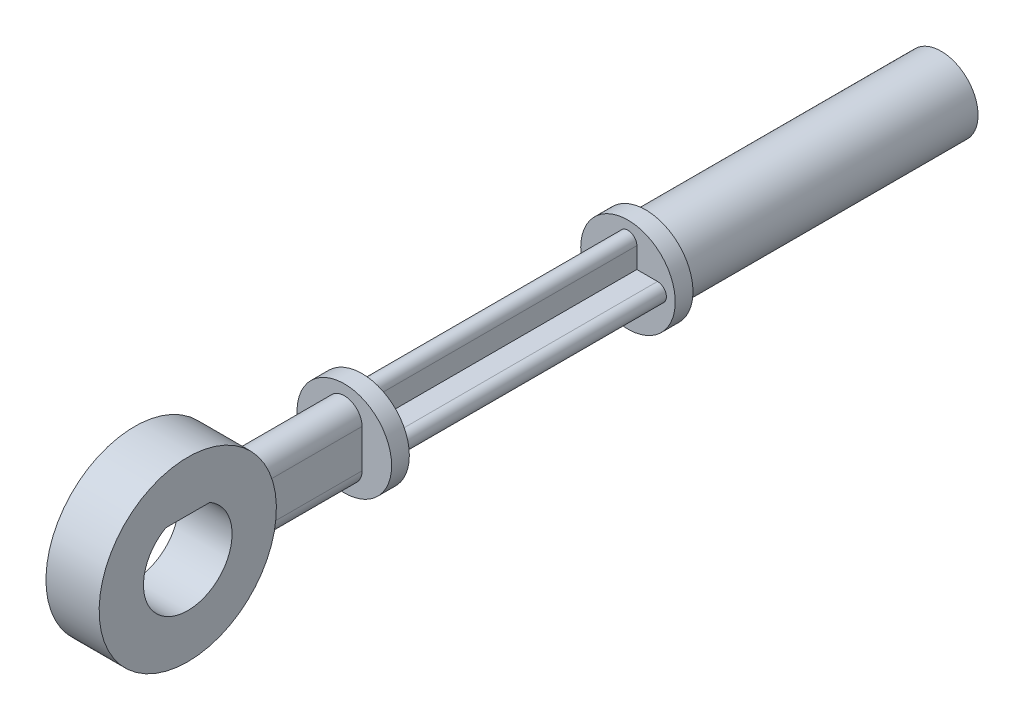
ISO-10303-21;
HEADER;
FILE_DESCRIPTION(('STEP AP214'),'2;1');
FILE_NAME('part.step','',(''),(''),'','','');
FILE_SCHEMA(('AUTOMOTIVE_DESIGN { 1 0 10303 214 1 1 1 1 }'));
ENDSEC;
DATA;
#1=APPLICATION_CONTEXT('core data for automotive mechanical design processes');
#2=APPLICATION_PROTOCOL_DEFINITION('international standard','automotive_design',2000,#1);
#3=PRODUCT_CONTEXT('',#1,'mechanical');
#4=PRODUCT('Part','Part','',(#3));
#5=PRODUCT_RELATED_PRODUCT_CATEGORY('part','',(#4));
#6=PRODUCT_DEFINITION_FORMATION('','',#4);
#7=PRODUCT_DEFINITION_CONTEXT('part definition',#1,'design');
#8=PRODUCT_DEFINITION('design','',#6,#7);
#9=PRODUCT_DEFINITION_SHAPE('','',#8);
#10=(LENGTH_UNIT() NAMED_UNIT(*) SI_UNIT(.MILLI.,.METRE.));
#11=(NAMED_UNIT(*) PLANE_ANGLE_UNIT() SI_UNIT($,.RADIAN.));
#12=(NAMED_UNIT(*) SI_UNIT($,.STERADIAN.) SOLID_ANGLE_UNIT());
#13=UNCERTAINTY_MEASURE_WITH_UNIT(LENGTH_MEASURE(1.E-05),#10,'distance_accuracy_value','');
#14=(GEOMETRIC_REPRESENTATION_CONTEXT(3) GLOBAL_UNCERTAINTY_ASSIGNED_CONTEXT((#13)) GLOBAL_UNIT_ASSIGNED_CONTEXT((#10,
#11,#12)) REPRESENTATION_CONTEXT('',''));
#15=CARTESIAN_POINT('',(0.,0.,0.));
#16=DIRECTION('',(0.,0.,1.));
#17=DIRECTION('',(1.,0.,0.));
#18=AXIS2_PLACEMENT_3D('',#15,#16,#17);
#19=CARTESIAN_POINT('',(0.,0.,-99.));
#20=DIRECTION('',(0.,0.,-1.));
#21=DIRECTION('',(-1.,0.,0.));
#22=AXIS2_PLACEMENT_3D('',#19,#20,#21);
#23=PLANE('',#22);
#24=CARTESIAN_POINT('',(0.,0.,-99.));
#25=DIRECTION('',(0.,0.,-1.));
#26=DIRECTION('',(-1.,0.,0.));
#27=AXIS2_PLACEMENT_3D('',#24,#25,#26);
#28=CIRCLE('',#27,16.);
#29=CARTESIAN_POINT('',(-16.,0.,-99.));
#30=VERTEX_POINT('',#29);
#31=EDGE_CURVE('E218',#30,#30,#28,.T.);
#32=ORIENTED_EDGE('',*,*,#31,.T.);
#33=EDGE_LOOP('',(#32));
#34=FACE_BOUND('',#33,.T.);
#35=CARTESIAN_POINT('',(0.,0.,-99.));
#36=DIRECTION('',(0.,0.,-1.));
#37=DIRECTION('',(-1.,0.,0.));
#38=AXIS2_PLACEMENT_3D('',#35,#36,#37);
#39=CIRCLE('',#38,12.5);
#40=CARTESIAN_POINT('',(-12.5,0.,-99.));
#41=VERTEX_POINT('',#40);
#42=EDGE_CURVE('E172',#41,#41,#39,.T.);
#43=ORIENTED_EDGE('',*,*,#42,.F.);
#44=EDGE_LOOP('',(#43));
#45=FACE_BOUND('',#44,.T.);
#46=ADVANCED_FACE('F32',(#34,#45),#23,.T.);
#47=CARTESIAN_POINT('',(0.,6.5,92.7308492477241));
#48=DIRECTION('',(0.,0.,-1.));
#49=DIRECTION('',(-1.,0.,0.));
#50=AXIS2_PLACEMENT_3D('',#47,#48,#49);
#51=CYLINDRICAL_SURFACE('',#50,6.);
#52=CARTESIAN_POINT('',(6.,6.5,35.7126307087851));
#53=CARTESIAN_POINT('',(6.00001683778245,6.67468075228206,35.7513827899035));
#54=CARTESIAN_POINT('',(5.99237280406724,6.8489880717354,35.7917237801018));
#55=CARTESIAN_POINT('',(5.96207767435945,7.19557585346838,35.8751790597631));
#56=CARTESIAN_POINT('',(5.93943067963163,7.36785685657382,35.9182925884074));
#57=CARTESIAN_POINT('',(5.87949365463989,7.70892613761199,36.0068366464332));
#58=CARTESIAN_POINT('',(5.84222793942424,7.87771972785439,36.0522632199486));
#59=CARTESIAN_POINT('',(5.75345581570317,8.21098845699761,36.1450251746138));
#60=CARTESIAN_POINT('',(5.70194864247199,8.37546336347795,36.1923606581501));
#61=CARTESIAN_POINT('',(5.58519716706877,8.69888805621716,36.2883684528415));
#62=CARTESIAN_POINT('',(5.51996442747944,8.85784236260664,36.3370396089882));
#63=CARTESIAN_POINT('',(5.37620421873952,9.1694341204862,36.4351935063338));
#64=CARTESIAN_POINT('',(5.29767188373591,9.32206923447952,36.4846765385639));
#65=CARTESIAN_POINT('',(5.12785042239082,9.6200250633754,36.5838114174756));
#66=CARTESIAN_POINT('',(5.03656053165549,9.76534533928499,36.6334632740987));
#67=CARTESIAN_POINT('',(4.84175083415795,10.0478011118079,36.7322782976936));
#68=CARTESIAN_POINT('',(4.73822677236185,10.1849337356549,36.781441288155));
#69=CARTESIAN_POINT('',(4.51716721019155,10.4529780434153,36.8796147474127));
#70=CARTESIAN_POINT('',(4.39937446066113,10.5836876542726,36.9285982847973));
#71=CARTESIAN_POINT('',(4.15234530538268,10.8346310046475,37.0244961286581));
#72=CARTESIAN_POINT('',(4.02310928578779,10.95486509739,37.0714105048782));
#73=CARTESIAN_POINT('',(3.75391275997439,11.1839492732298,37.1623551029291));
#74=CARTESIAN_POINT('',(3.61395004245452,11.2927969980387,37.2063847265815));
#75=CARTESIAN_POINT('',(3.3242357691165,11.4980955891339,37.2906854851511));
#76=CARTESIAN_POINT('',(3.17448871142096,11.5945520923382,37.3309583267747));
#77=CARTESIAN_POINT('',(2.87078464391185,11.7714837508394,37.4057774073163));
#78=CARTESIAN_POINT('',(2.71709124372377,11.8523534892461,37.4404598327866));
#79=CARTESIAN_POINT('',(2.40246071407756,12.0007653142001,37.5047608710439));
#80=CARTESIAN_POINT('',(2.24152699866434,12.0683136030061,37.5343818395041));
#81=CARTESIAN_POINT('',(1.91359644038432,12.1893481973649,37.587882748261));
#82=CARTESIAN_POINT('',(1.74660196775954,12.2428399341293,37.6117649056302));
#83=CARTESIAN_POINT('',(1.40783822847228,12.3351351500465,37.6532084590827));
#84=CARTESIAN_POINT('',(1.23606938442583,12.3739399248378,37.6707704127083));
#85=CARTESIAN_POINT('',(0.903621100762744,12.4337667400527,37.6979409440212));
#86=CARTESIAN_POINT('',(0.743201835135048,12.4559956465904,37.7080878792075));
#87=CARTESIAN_POINT('',(0.420830878069553,12.4874137428258,37.7224487915005));
#88=CARTESIAN_POINT('',(0.258879283040831,12.496603747468,37.7266631393996));
#89=CARTESIAN_POINT('',(-0.0652387444608819,12.5018337900902,37.7290601610141));
#90=CARTESIAN_POINT('',(-0.227405112738761,12.4978771311422,37.7272443497944));
#91=CARTESIAN_POINT('',(-0.550706527694209,12.4768688901763,37.7176270079332));
#92=CARTESIAN_POINT('',(-0.71184159286459,12.459817543633,37.7098255849276));
#93=CARTESIAN_POINT('',(-1.02365872177968,12.4140237130941,37.6889654220295));
#94=CARTESIAN_POINT('',(-1.17445482325386,12.3859217222193,37.6761950492769));
#95=CARTESIAN_POINT('',(-1.47302447587425,12.3183874570156,37.6456821960013));
#96=CARTESIAN_POINT('',(-1.62079702941188,12.2789515056622,37.627938101923));
#97=CARTESIAN_POINT('',(-1.91228800647657,12.1891481682919,37.5878296912271));
#98=CARTESIAN_POINT('',(-2.05600752773881,12.138783774929,37.5654666395495));
#99=CARTESIAN_POINT('',(-2.33863654755367,12.0275541860307,37.5165207456575));
#100=CARTESIAN_POINT('',(-2.47754419146611,11.9666849945357,37.489936297959));
#101=CARTESIAN_POINT('',(-2.7543570847781,11.8327240034637,37.4320450664053));
#102=CARTESIAN_POINT('',(-2.89206887161332,11.7592879275982,37.4006087892597));
#103=CARTESIAN_POINT('',(-3.16076574160381,11.6023332374764,37.3342606440919));
#104=CARTESIAN_POINT('',(-3.29174833038958,11.5188109223605,37.2993475011612));
#105=CARTESIAN_POINT('',(-3.67354374120753,11.2540353473667,37.1902345367156));
#106=CARTESIAN_POINT('',(-3.91339510347169,11.0584804009261,37.111620175261));
#107=CARTESIAN_POINT('',(-4.37696518912197,10.617380967419,36.9405705041942));
#108=CARTESIAN_POINT('',(-4.59781140182168,10.3690729990156,36.8475316442243));
#109=CARTESIAN_POINT('',(-4.99540001380377,9.8399695565974,36.6582686648298));
#110=CARTESIAN_POINT('',(-5.17211297195058,9.55915257774347,36.5620424673564));
#111=CARTESIAN_POINT('',(-5.40510638118059,9.11064256727742,36.4163864060729));
#112=CARTESIAN_POINT('',(-5.47889311474076,8.95201500010147,36.3662769031273));
#113=CARTESIAN_POINT('',(-5.61243633291475,8.62864118787876,36.2671777237326));
#114=CARTESIAN_POINT('',(-5.6721977695104,8.46389712627992,36.2181876575695));
#115=CARTESIAN_POINT('',(-5.77712565048855,8.12956823072953,36.1219744345669));
#116=CARTESIAN_POINT('',(-5.82230945735638,7.95998941922634,36.0747492354524));
#117=CARTESIAN_POINT('',(-5.8977186838957,7.61701279019291,35.9825462868492));
#118=CARTESIAN_POINT('',(-5.92795163238172,7.44361694085584,35.9375674164552));
#119=CARTESIAN_POINT('',(-5.96696182779359,7.14173021115617,35.8621744633888));
#120=CARTESIAN_POINT('',(-5.97933805586961,7.01385157516138,35.8311260498781));
#121=CARTESIAN_POINT('',(-5.99585278927128,6.75738395005319,35.7706456211464));
#122=CARTESIAN_POINT('',(-6.00000340400173,6.62879628502926,35.7412112919483));
#123=CARTESIAN_POINT('',(-6.,6.5,35.7126307087851));
#124=B_SPLINE_CURVE_WITH_KNOTS('',3,(#52,#53,#54,#55,#56,#57,#58,#59,#60,#61,#62,#63,#64,#65,
#66,#67,#68,#69,#70,#71,#72,#73,#74,#75,#76,#77,#78,#79,#80,#81,#82,#83,#84,#85,#86,#87,#88,#89,
#90,#91,#92,#93,#94,#95,#96,#97,#98,#99,#100,#101,#102,#103,#104,#105,#106,#107,#108,#109,#110,
#111,#112,#113,#114,#115,#116,#117,#118,#119,#120,#121,#122,#123),.UNSPECIFIED.,.F.,.F.,(4,2,2,
2,2,2,2,2,2,2,2,2,2,2,2,2,2,2,2,2,2,2,2,2,2,2,2,2,2,2,2,2,2,2,2,4),(0.,0.536582696290646,
1.07301877085063,1.60856635872044,2.14414270955804,2.67926967795391,3.21459285508804,
3.74994812091761,4.28549013387307,4.83276333273559,5.38001807089781,5.92738593028416,
6.47450389688051,7.00510328638206,7.53545505084579,8.06560159413498,8.59570135862397,
9.08188575218811,9.56803975740318,10.0540716266728,10.540094756106,11.0013345217406,
11.4627240945037,11.923987479037,12.3854267135929,12.8625019765631,13.3397528237065,
14.2936127461333,15.3245982361516,16.3562696667472,16.9016825190223,17.4469025089587,
17.9914707040763,18.5357643906373,18.9320335742627,19.3277189522879),.UNSPECIFIED.);
#125=CARTESIAN_POINT('',(6.,6.5,35.7126307087851));
#126=VERTEX_POINT('',#125);
#127=CARTESIAN_POINT('',(-6.,6.5,35.7126307087851));
#128=VERTEX_POINT('',#127);
#129=EDGE_CURVE('E210',#126,#128,#124,.T.);
#130=ORIENTED_EDGE('',*,*,#129,.F.);
#131=DIRECTION('',(0.,0.,-1.));
#132=VECTOR('',#131,1.);
#133=CARTESIAN_POINT('',(6.,6.5,92.7308492477241));
#134=LINE('',#133,#132);
#135=CARTESIAN_POINT('',(6.,6.5,3.));
#136=VERTEX_POINT('',#135);
#137=EDGE_CURVE('E310',#126,#136,#134,.T.);
#138=ORIENTED_EDGE('',*,*,#137,.T.);
#139=CARTESIAN_POINT('',(0.,6.5,3.));
#140=DIRECTION('',(0.,0.,1.));
#141=DIRECTION('',(1.,0.,0.));
#142=AXIS2_PLACEMENT_3D('',#139,#140,#141);
#143=CIRCLE('',#142,6.);
#144=CARTESIAN_POINT('',(-6.,6.5,3.));
#145=VERTEX_POINT('',#144);
#146=EDGE_CURVE('E326',#136,#145,#143,.T.);
#147=ORIENTED_EDGE('',*,*,#146,.T.);
#148=DIRECTION('',(0.,0.,-1.));
#149=VECTOR('',#148,1.);
#150=CARTESIAN_POINT('',(-6.,6.5,92.7308492477241));
#151=LINE('',#150,#149);
#152=EDGE_CURVE('E322',#128,#145,#151,.T.);
#153=ORIENTED_EDGE('',*,*,#152,.F.);
#154=EDGE_LOOP('',(#130,#138,#147,#153));
#155=FACE_BOUND('',#154,.T.);
#156=ADVANCED_FACE('F220',(#155),#51,.T.);
#157=CARTESIAN_POINT('',(0.,-6.5,92.7308492477241));
#158=DIRECTION('',(0.,0.,-1.));
#159=DIRECTION('',(-1.,0.,0.));
#160=AXIS2_PLACEMENT_3D('',#157,#158,#159);
#161=CYLINDRICAL_SURFACE('',#160,6.);
#162=CARTESIAN_POINT('',(-6.,-6.5,35.7126307087851));
#163=CARTESIAN_POINT('',(-6.00001683778245,-6.67468075228206,35.7513827899035));
#164=CARTESIAN_POINT('',(-5.99237280406724,-6.8489880717354,35.7917237801018));
#165=CARTESIAN_POINT('',(-5.96207767435946,-7.19557585346838,35.8751790597631));
#166=CARTESIAN_POINT('',(-5.93943067963163,-7.36785685657382,35.9182925884074));
#167=CARTESIAN_POINT('',(-5.8794936546399,-7.70892613761199,36.0068366464332));
#168=CARTESIAN_POINT('',(-5.84222793942425,-7.87771972785439,36.0522632199486));
#169=CARTESIAN_POINT('',(-5.75345581570318,-8.21098845699761,36.1450251746138));
#170=CARTESIAN_POINT('',(-5.70194864247199,-8.37546336347795,36.1923606581501));
#171=CARTESIAN_POINT('',(-5.58519716706877,-8.69888805621716,36.2883684528415));
#172=CARTESIAN_POINT('',(-5.51996442747945,-8.85784236260664,36.3370396089882));
#173=CARTESIAN_POINT('',(-5.37620421873952,-9.1694341204862,36.4351935063338));
#174=CARTESIAN_POINT('',(-5.29767188373592,-9.32206923447952,36.4846765385639));
#175=CARTESIAN_POINT('',(-5.12785042239082,-9.6200250633754,36.5838114174756));
#176=CARTESIAN_POINT('',(-5.0365605316555,-9.76534533928499,36.6334632740987));
#177=CARTESIAN_POINT('',(-4.84175083415796,-10.0478011118079,36.7322782976936));
#178=CARTESIAN_POINT('',(-4.73822677236185,-10.1849337356549,36.781441288155));
#179=CARTESIAN_POINT('',(-4.51716721019156,-10.4529780434153,36.8796147474127));
#180=CARTESIAN_POINT('',(-4.39937446066113,-10.5836876542726,36.9285982847973));
#181=CARTESIAN_POINT('',(-4.15234530538269,-10.8346310046475,37.0244961286581));
#182=CARTESIAN_POINT('',(-4.0231092857878,-10.95486509739,37.0714105048782));
#183=CARTESIAN_POINT('',(-3.75391275997439,-11.1839492732298,37.1623551029291));
#184=CARTESIAN_POINT('',(-3.61395004245453,-11.2927969980387,37.2063847265815));
#185=CARTESIAN_POINT('',(-3.32423576911651,-11.4980955891339,37.2906854851511));
#186=CARTESIAN_POINT('',(-3.17448871142096,-11.5945520923382,37.3309583267747));
#187=CARTESIAN_POINT('',(-2.87078464391185,-11.7714837508394,37.4057774073163));
#188=CARTESIAN_POINT('',(-2.71709124372377,-11.8523534892461,37.4404598327866));
#189=CARTESIAN_POINT('',(-2.40246071407756,-12.0007653142001,37.5047608710439));
#190=CARTESIAN_POINT('',(-2.24152699866434,-12.0683136030061,37.5343818395041));
#191=CARTESIAN_POINT('',(-1.91359644038432,-12.1893481973649,37.587882748261));
#192=CARTESIAN_POINT('',(-1.74660196775955,-12.2428399341293,37.6117649056302));
#193=CARTESIAN_POINT('',(-1.40783822847229,-12.3351351500465,37.6532084590827));
#194=CARTESIAN_POINT('',(-1.23606938442584,-12.3739399248378,37.6707704127083));
#195=CARTESIAN_POINT('',(-0.903621100762745,-12.4337667400527,37.6979409440212));
#196=CARTESIAN_POINT('',(-0.743201835135049,-12.4559956465904,37.7080878792075));
#197=CARTESIAN_POINT('',(-0.420830878069553,-12.4874137428258,37.7224487915005));
#198=CARTESIAN_POINT('',(-0.258879283040831,-12.496603747468,37.7266631393996));
#199=CARTESIAN_POINT('',(0.0652387444608805,-12.5018337900902,37.7290601610141));
#200=CARTESIAN_POINT('',(0.227405112738759,-12.4978771311422,37.7272443497944));
#201=CARTESIAN_POINT('',(0.550706527694206,-12.4768688901763,37.7176270079332));
#202=CARTESIAN_POINT('',(0.711841592864588,-12.459817543633,37.7098255849276));
#203=CARTESIAN_POINT('',(1.02365872177968,-12.4140237130941,37.6889654220295));
#204=CARTESIAN_POINT('',(1.17445482325386,-12.3859217222193,37.6761950492769));
#205=CARTESIAN_POINT('',(1.47302447587425,-12.3183874570156,37.6456821960013));
#206=CARTESIAN_POINT('',(1.62079702941187,-12.2789515056622,37.627938101923));
#207=CARTESIAN_POINT('',(1.91228800647656,-12.1891481682919,37.5878296912271));
#208=CARTESIAN_POINT('',(2.05600752773881,-12.138783774929,37.5654666395495));
#209=CARTESIAN_POINT('',(2.33863654755366,-12.0275541860307,37.5165207456575));
#210=CARTESIAN_POINT('',(2.4775441914661,-11.9666849945357,37.489936297959));
#211=CARTESIAN_POINT('',(2.7543570847781,-11.8327240034637,37.4320450664053));
#212=CARTESIAN_POINT('',(2.89206887161332,-11.7592879275982,37.4006087892597));
#213=CARTESIAN_POINT('',(3.16076574160381,-11.6023332374764,37.3342606440919));
#214=CARTESIAN_POINT('',(3.29174833038958,-11.5188109223605,37.2993475011612));
#215=CARTESIAN_POINT('',(3.67354374120753,-11.2540353473667,37.1902345367156));
#216=CARTESIAN_POINT('',(3.91339510347169,-11.0584804009261,37.111620175261));
#217=CARTESIAN_POINT('',(4.37696518912197,-10.617380967419,36.9405705041942));
#218=CARTESIAN_POINT('',(4.59781140182167,-10.3690729990156,36.8475316442243));
#219=CARTESIAN_POINT('',(4.99540001380377,-9.8399695565974,36.6582686648298));
#220=CARTESIAN_POINT('',(5.17211297195058,-9.55915257774347,36.5620424673564));
#221=CARTESIAN_POINT('',(5.40510638118058,-9.11064256727742,36.4163864060729));
#222=CARTESIAN_POINT('',(5.47889311474076,-8.95201500010147,36.3662769031273));
#223=CARTESIAN_POINT('',(5.61243633291474,-8.62864118787876,36.2671777237326));
#224=CARTESIAN_POINT('',(5.6721977695104,-8.46389712627993,36.2181876575695));
#225=CARTESIAN_POINT('',(5.77712565048855,-8.12956823072953,36.1219744345669));
#226=CARTESIAN_POINT('',(5.82230945735638,-7.95998941922634,36.0747492354524));
#227=CARTESIAN_POINT('',(5.89771868389569,-7.61701279019291,35.9825462868492));
#228=CARTESIAN_POINT('',(5.92795163238172,-7.44361694085584,35.9375674164552));
#229=CARTESIAN_POINT('',(5.96696182779359,-7.14173021115616,35.8621744633888));
#230=CARTESIAN_POINT('',(5.97933805586961,-7.01385157516137,35.8311260498781));
#231=CARTESIAN_POINT('',(5.99585278927128,-6.75738395005319,35.7706456211464));
#232=CARTESIAN_POINT('',(6.00000340400172,-6.62879628502926,35.7412112919483));
#233=CARTESIAN_POINT('',(6.,-6.5,35.7126307087851));
#234=B_SPLINE_CURVE_WITH_KNOTS('',3,(#162,#163,#164,#165,#166,#167,#168,#169,#170,#171,#172,
#173,#174,#175,#176,#177,#178,#179,#180,#181,#182,#183,#184,#185,#186,#187,#188,#189,#190,#191,
#192,#193,#194,#195,#196,#197,#198,#199,#200,#201,#202,#203,#204,#205,#206,#207,#208,#209,#210,
#211,#212,#213,#214,#215,#216,#217,#218,#219,#220,#221,#222,#223,#224,#225,#226,#227,#228,#229,
#230,#231,#232,#233),.UNSPECIFIED.,.F.,.F.,(4,2,2,2,2,2,2,2,2,2,2,2,2,2,2,2,2,2,2,2,2,2,2,2,2,2,
2,2,2,2,2,2,2,2,2,4),(0.,0.536582696290643,1.07301877085063,1.60856635872044,2.14414270955804,
2.67926967795391,3.21459285508804,3.74994812091761,4.28549013387307,4.83276333273559,
5.38001807089781,5.92738593028416,6.47450389688051,7.00510328638206,7.53545505084579,
8.06560159413498,8.59570135862398,9.08188575218811,9.56803975740318,10.0540716266728,
10.540094756106,11.0013345217406,11.4627240945037,11.923987479037,12.3854267135929,
12.8625019765631,13.3397528237065,14.2936127461333,15.3245982361516,16.3562696667472,
16.9016825190223,17.4469025089587,17.9914707040763,18.5357643906373,18.9320335742627,
19.3277189522879),.UNSPECIFIED.);
#235=CARTESIAN_POINT('',(-6.,-6.5,35.7126307087851));
#236=VERTEX_POINT('',#235);
#237=CARTESIAN_POINT('',(6.,-6.5,35.7126307087851));
#238=VERTEX_POINT('',#237);
#239=EDGE_CURVE('E185',#236,#238,#234,.T.);
#240=ORIENTED_EDGE('',*,*,#239,.F.);
#241=DIRECTION('',(0.,0.,-1.));
#242=VECTOR('',#241,1.);
#243=CARTESIAN_POINT('',(-6.,-6.5,92.7308492477241));
#244=LINE('',#243,#242);
#245=CARTESIAN_POINT('',(-6.,-6.5,3.));
#246=VERTEX_POINT('',#245);
#247=EDGE_CURVE('E324',#236,#246,#244,.T.);
#248=ORIENTED_EDGE('',*,*,#247,.T.);
#249=CARTESIAN_POINT('',(0.,-6.5,3.));
#250=DIRECTION('',(0.,0.,1.));
#251=DIRECTION('',(1.,0.,0.));
#252=AXIS2_PLACEMENT_3D('',#249,#250,#251);
#253=CIRCLE('',#252,6.);
#254=CARTESIAN_POINT('',(6.,-6.5,3.));
#255=VERTEX_POINT('',#254);
#256=EDGE_CURVE('E315',#246,#255,#253,.T.);
#257=ORIENTED_EDGE('',*,*,#256,.T.);
#258=DIRECTION('',(0.,0.,-1.));
#259=VECTOR('',#258,1.);
#260=CARTESIAN_POINT('',(6.,-6.5,92.7308492477241));
#261=LINE('',#260,#259);
#262=EDGE_CURVE('E308',#238,#255,#261,.T.);
#263=ORIENTED_EDGE('',*,*,#262,.F.);
#264=EDGE_LOOP('',(#240,#248,#257,#263));
#265=FACE_BOUND('',#264,.T.);
#266=ADVANCED_FACE('F195',(#265),#161,.T.);
#267=CARTESIAN_POINT('',(0.,0.,-3.));
#268=DIRECTION('',(0.,0.,1.));
#269=DIRECTION('',(1.,0.,0.));
#270=AXIS2_PLACEMENT_3D('',#267,#268,#269);
#271=PLANE('',#270);
#272=CARTESIAN_POINT('',(0.,0.,-3.));
#273=DIRECTION('',(0.,0.,1.));
#274=DIRECTION('',(1.,0.,0.));
#275=AXIS2_PLACEMENT_3D('',#272,#273,#274);
#276=CIRCLE('',#275,16.);
#277=CARTESIAN_POINT('',(16.,0.,-3.));
#278=VERTEX_POINT('',#277);
#279=EDGE_CURVE('E337',#278,#278,#276,.T.);
#280=ORIENTED_EDGE('',*,*,#279,.F.);
#281=EDGE_LOOP('',(#280));
#282=FACE_BOUND('',#281,.T.);
#283=DIRECTION('',(1.,0.,0.));
#284=VECTOR('',#283,1.);
#285=CARTESIAN_POINT('',(10.,3.,-3.));
#286=LINE('',#285,#284);
#287=CARTESIAN_POINT('',(3.,3.,-3.));
#288=VERTEX_POINT('',#287);
#289=CARTESIAN_POINT('',(10.,3.,-3.));
#290=VERTEX_POINT('',#289);
#291=EDGE_CURVE('E413',#288,#290,#286,.T.);
#292=ORIENTED_EDGE('',*,*,#291,.F.);
#293=DIRECTION('',(0.,-1.,0.));
#294=VECTOR('',#293,1.);
#295=CARTESIAN_POINT('',(3.,3.,-3.));
#296=LINE('',#295,#294);
#297=CARTESIAN_POINT('',(3.,10.,-3.));
#298=VERTEX_POINT('',#297);
#299=EDGE_CURVE('E379',#298,#288,#296,.T.);
#300=ORIENTED_EDGE('',*,*,#299,.F.);
#301=CARTESIAN_POINT('',(0.,10.,-3.));
#302=DIRECTION('',(0.,0.,-1.));
#303=DIRECTION('',(1.,0.,0.));
#304=AXIS2_PLACEMENT_3D('',#301,#302,#303);
#305=CIRCLE('',#304,3.);
#306=CARTESIAN_POINT('',(-3.,10.,-3.));
#307=VERTEX_POINT('',#306);
#308=EDGE_CURVE('E383',#307,#298,#305,.T.);
#309=ORIENTED_EDGE('',*,*,#308,.F.);
#310=DIRECTION('',(0.,1.,0.));
#311=VECTOR('',#310,1.);
#312=CARTESIAN_POINT('',(-3.,10.,-3.));
#313=LINE('',#312,#311);
#314=CARTESIAN_POINT('',(-3.,3.,-3.));
#315=VERTEX_POINT('',#314);
#316=EDGE_CURVE('E386',#315,#307,#313,.T.);
#317=ORIENTED_EDGE('',*,*,#316,.F.);
#318=DIRECTION('',(1.,0.,0.));
#319=VECTOR('',#318,1.);
#320=CARTESIAN_POINT('',(-3.,3.,-3.));
#321=LINE('',#320,#319);
#322=CARTESIAN_POINT('',(-10.,3.,-3.));
#323=VERTEX_POINT('',#322);
#324=EDGE_CURVE('E389',#323,#315,#321,.T.);
#325=ORIENTED_EDGE('',*,*,#324,.F.);
#326=CARTESIAN_POINT('',(-10.,0.,-3.));
#327=DIRECTION('',(0.,0.,-1.));
#328=DIRECTION('',(1.,0.,0.));
#329=AXIS2_PLACEMENT_3D('',#326,#327,#328);
#330=CIRCLE('',#329,3.);
#331=CARTESIAN_POINT('',(-10.,-3.,-3.));
#332=VERTEX_POINT('',#331);
#333=EDGE_CURVE('E392',#332,#323,#330,.T.);
#334=ORIENTED_EDGE('',*,*,#333,.F.);
#335=DIRECTION('',(-1.,0.,0.));
#336=VECTOR('',#335,1.);
#337=CARTESIAN_POINT('',(-10.,-3.,-3.));
#338=LINE('',#337,#336);
#339=CARTESIAN_POINT('',(-3.,-3.,-3.));
#340=VERTEX_POINT('',#339);
#341=EDGE_CURVE('E395',#340,#332,#338,.T.);
#342=ORIENTED_EDGE('',*,*,#341,.F.);
#343=DIRECTION('',(0.,1.,0.));
#344=VECTOR('',#343,1.);
#345=CARTESIAN_POINT('',(-3.,-3.,-3.));
#346=LINE('',#345,#344);
#347=CARTESIAN_POINT('',(-3.,-10.,-3.));
#348=VERTEX_POINT('',#347);
#349=EDGE_CURVE('E398',#348,#340,#346,.T.);
#350=ORIENTED_EDGE('',*,*,#349,.F.);
#351=CARTESIAN_POINT('',(0.,-10.,-3.));
#352=DIRECTION('',(0.,0.,-1.));
#353=DIRECTION('',(1.,0.,0.));
#354=AXIS2_PLACEMENT_3D('',#351,#352,#353);
#355=CIRCLE('',#354,3.);
#356=CARTESIAN_POINT('',(3.,-10.,-3.));
#357=VERTEX_POINT('',#356);
#358=EDGE_CURVE('E401',#357,#348,#355,.T.);
#359=ORIENTED_EDGE('',*,*,#358,.F.);
#360=DIRECTION('',(0.,-1.,0.));
#361=VECTOR('',#360,1.);
#362=CARTESIAN_POINT('',(3.,-10.,-3.));
#363=LINE('',#362,#361);
#364=CARTESIAN_POINT('',(3.,-3.,-3.));
#365=VERTEX_POINT('',#364);
#366=EDGE_CURVE('E404',#365,#357,#363,.T.);
#367=ORIENTED_EDGE('',*,*,#366,.F.);
#368=DIRECTION('',(-1.,0.,0.));
#369=VECTOR('',#368,1.);
#370=CARTESIAN_POINT('',(3.,-3.,-3.));
#371=LINE('',#370,#369);
#372=CARTESIAN_POINT('',(10.,-3.,-3.));
#373=VERTEX_POINT('',#372);
#374=EDGE_CURVE('E407',#373,#365,#371,.T.);
#375=ORIENTED_EDGE('',*,*,#374,.F.);
#376=CARTESIAN_POINT('',(10.,0.,-3.));
#377=DIRECTION('',(0.,0.,-1.));
#378=DIRECTION('',(1.,0.,0.));
#379=AXIS2_PLACEMENT_3D('',#376,#377,#378);
#380=CIRCLE('',#379,3.);
#381=EDGE_CURVE('E410',#290,#373,#380,.T.);
#382=ORIENTED_EDGE('',*,*,#381,.F.);
#383=EDGE_LOOP('',(#292,#300,#309,#317,#325,#334,#342,#350,#359,#367,#375,#382));
#384=FACE_BOUND('',#383,.T.);
#385=ADVANCED_FACE('F228',(#282,#384),#271,.F.);
#386=CARTESIAN_POINT('',(0.,0.,3.));
#387=DIRECTION('',(0.,0.,1.));
#388=DIRECTION('',(1.,0.,0.));
#389=AXIS2_PLACEMENT_3D('',#386,#387,#388);
#390=PLANE('',#389);
#391=CARTESIAN_POINT('',(0.,0.,3.));
#392=DIRECTION('',(0.,0.,1.));
#393=DIRECTION('',(1.,0.,0.));
#394=AXIS2_PLACEMENT_3D('',#391,#392,#393);
#395=CIRCLE('',#394,16.);
#396=CARTESIAN_POINT('',(16.,0.,3.));
#397=VERTEX_POINT('',#396);
#398=EDGE_CURVE('E40',#397,#397,#395,.T.);
#399=ORIENTED_EDGE('',*,*,#398,.T.);
#400=EDGE_LOOP('',(#399));
#401=FACE_BOUND('',#400,.T.);
#402=DIRECTION('',(0.,-1.,0.));
#403=VECTOR('',#402,1.);
#404=CARTESIAN_POINT('',(-6.,6.5,3.));
#405=LINE('',#404,#403);
#406=EDGE_CURVE('E328',#145,#246,#405,.T.);
#407=ORIENTED_EDGE('',*,*,#406,.F.);
#408=ORIENTED_EDGE('',*,*,#146,.F.);
#409=DIRECTION('',(0.,1.,0.));
#410=VECTOR('',#409,1.);
#411=CARTESIAN_POINT('',(6.,6.5,3.));
#412=LINE('',#411,#410);
#413=EDGE_CURVE('E317',#255,#136,#412,.T.);
#414=ORIENTED_EDGE('',*,*,#413,.F.);
#415=ORIENTED_EDGE('',*,*,#256,.F.);
#416=EDGE_LOOP('',(#407,#408,#414,#415));
#417=FACE_BOUND('',#416,.T.);
#418=ADVANCED_FACE('F226',(#401,#417),#390,.T.);
#419=CARTESIAN_POINT('',(0.,0.,3.));
#420=DIRECTION('',(0.,0.,-1.));
#421=DIRECTION('',(-1.,0.,0.));
#422=AXIS2_PLACEMENT_3D('',#419,#420,#421);
#423=CYLINDRICAL_SURFACE('',#422,16.);
#424=ORIENTED_EDGE('',*,*,#398,.F.);
#425=EDGE_LOOP('',(#424));
#426=FACE_BOUND('',#425,.T.);
#427=ORIENTED_EDGE('',*,*,#279,.T.);
#428=EDGE_LOOP('',(#427));
#429=FACE_BOUND('',#428,.T.);
#430=ADVANCED_FACE('F34',(#426,#429),#423,.T.);
#431=CARTESIAN_POINT('',(-6.,6.5,92.7308492477241));
#432=DIRECTION('',(1.,0.,0.));
#433=DIRECTION('',(0.,0.,-1.));
#434=AXIS2_PLACEMENT_3D('',#431,#432,#433);
#435=PLANE('',#434);
#436=CARTESIAN_POINT('',(-6.,0.,65.));
#437=DIRECTION('',(1.,0.,0.));
#438=DIRECTION('',(0.,0.,-1.));
#439=AXIS2_PLACEMENT_3D('',#436,#437,#438);
#440=CIRCLE('',#439,30.);
#441=EDGE_CURVE('E193',#128,#236,#440,.F.);
#442=ORIENTED_EDGE('',*,*,#441,.F.);
#443=ORIENTED_EDGE('',*,*,#152,.T.);
#444=ORIENTED_EDGE('',*,*,#406,.T.);
#445=ORIENTED_EDGE('',*,*,#247,.F.);
#446=EDGE_LOOP('',(#442,#443,#444,#445));
#447=FACE_BOUND('',#446,.T.);
#448=ADVANCED_FACE('F225',(#447),#435,.F.);
#449=CARTESIAN_POINT('',(6.,6.5,92.7308492477241));
#450=DIRECTION('',(-1.,0.,0.));
#451=DIRECTION('',(0.,0.,1.));
#452=AXIS2_PLACEMENT_3D('',#449,#450,#451);
#453=PLANE('',#452);
#454=CARTESIAN_POINT('',(6.,0.,65.));
#455=DIRECTION('',(-1.,0.,0.));
#456=DIRECTION('',(0.,0.,1.));
#457=AXIS2_PLACEMENT_3D('',#454,#455,#456);
#458=CIRCLE('',#457,30.);
#459=EDGE_CURVE('E11',#238,#126,#458,.F.);
#460=ORIENTED_EDGE('',*,*,#459,.F.);
#461=ORIENTED_EDGE('',*,*,#262,.T.);
#462=ORIENTED_EDGE('',*,*,#413,.T.);
#463=ORIENTED_EDGE('',*,*,#137,.F.);
#464=EDGE_LOOP('',(#460,#461,#462,#463));
#465=FACE_BOUND('',#464,.T.);
#466=ADVANCED_FACE('F298',(#465),#453,.F.);
#467=CARTESIAN_POINT('',(10.,3.,-93.));
#468=DIRECTION('',(0.,-1.,0.));
#469=DIRECTION('',(0.,0.,-1.));
#470=AXIS2_PLACEMENT_3D('',#467,#468,#469);
#471=PLANE('',#470);
#472=ORIENTED_EDGE('',*,*,#291,.T.);
#473=DIRECTION('',(0.,0.,1.));
#474=VECTOR('',#473,1.);
#475=CARTESIAN_POINT('',(10.,3.,-93.));
#476=LINE('',#475,#474);
#477=CARTESIAN_POINT('',(10.,3.,-93.));
#478=VERTEX_POINT('',#477);
#479=EDGE_CURVE('E335',#478,#290,#476,.T.);
#480=ORIENTED_EDGE('',*,*,#479,.F.);
#481=DIRECTION('',(1.,0.,0.));
#482=VECTOR('',#481,1.);
#483=CARTESIAN_POINT('',(10.,3.,-93.));
#484=LINE('',#483,#482);
#485=CARTESIAN_POINT('',(3.,3.,-93.));
#486=VERTEX_POINT('',#485);
#487=EDGE_CURVE('E382',#486,#478,#484,.T.);
#488=ORIENTED_EDGE('',*,*,#487,.F.);
#489=DIRECTION('',(0.,0.,1.));
#490=VECTOR('',#489,1.);
#491=CARTESIAN_POINT('',(3.,3.,-93.));
#492=LINE('',#491,#490);
#493=EDGE_CURVE('E375',#486,#288,#492,.T.);
#494=ORIENTED_EDGE('',*,*,#493,.T.);
#495=EDGE_LOOP('',(#472,#480,#488,#494));
#496=FACE_BOUND('',#495,.T.);
#497=ADVANCED_FACE('F295',(#496),#471,.F.);
#498=CARTESIAN_POINT('',(10.,0.,-93.));
#499=DIRECTION('',(0.,0.,1.));
#500=DIRECTION('',(1.,0.,0.));
#501=AXIS2_PLACEMENT_3D('',#498,#499,#500);
#502=CYLINDRICAL_SURFACE('',#501,3.);
#503=ORIENTED_EDGE('',*,*,#381,.T.);
#504=DIRECTION('',(0.,0.,1.));
#505=VECTOR('',#504,1.);
#506=CARTESIAN_POINT('',(10.,-3.,-93.));
#507=LINE('',#506,#505);
#508=CARTESIAN_POINT('',(10.,-3.,-93.));
#509=VERTEX_POINT('',#508);
#510=EDGE_CURVE('E345',#509,#373,#507,.T.);
#511=ORIENTED_EDGE('',*,*,#510,.F.);
#512=CARTESIAN_POINT('',(10.,0.,-93.));
#513=DIRECTION('',(0.,0.,-1.));
#514=DIRECTION('',(1.,0.,0.));
#515=AXIS2_PLACEMENT_3D('',#512,#513,#514);
#516=CIRCLE('',#515,3.);
#517=EDGE_CURVE('E445',#478,#509,#516,.T.);
#518=ORIENTED_EDGE('',*,*,#517,.F.);
#519=ORIENTED_EDGE('',*,*,#479,.T.);
#520=EDGE_LOOP('',(#503,#511,#518,#519));
#521=FACE_BOUND('',#520,.T.);
#522=ADVANCED_FACE('F291',(#521),#502,.T.);
#523=CARTESIAN_POINT('',(3.,-3.,-93.));
#524=DIRECTION('',(0.,1.,0.));
#525=DIRECTION('',(0.,0.,1.));
#526=AXIS2_PLACEMENT_3D('',#523,#524,#525);
#527=PLANE('',#526);
#528=ORIENTED_EDGE('',*,*,#374,.T.);
#529=DIRECTION('',(0.,0.,1.));
#530=VECTOR('',#529,1.);
#531=CARTESIAN_POINT('',(3.,-3.,-93.));
#532=LINE('',#531,#530);
#533=CARTESIAN_POINT('',(3.,-3.,-93.));
#534=VERTEX_POINT('',#533);
#535=EDGE_CURVE('E348',#534,#365,#532,.T.);
#536=ORIENTED_EDGE('',*,*,#535,.F.);
#537=DIRECTION('',(-1.,0.,0.));
#538=VECTOR('',#537,1.);
#539=CARTESIAN_POINT('',(3.,-3.,-93.));
#540=LINE('',#539,#538);
#541=EDGE_CURVE('E442',#509,#534,#540,.T.);
#542=ORIENTED_EDGE('',*,*,#541,.F.);
#543=ORIENTED_EDGE('',*,*,#510,.T.);
#544=EDGE_LOOP('',(#528,#536,#542,#543));
#545=FACE_BOUND('',#544,.T.);
#546=ADVANCED_FACE('F287',(#545),#527,.F.);
#547=CARTESIAN_POINT('',(3.,-10.,-93.));
#548=DIRECTION('',(-1.,0.,0.));
#549=DIRECTION('',(0.,0.,1.));
#550=AXIS2_PLACEMENT_3D('',#547,#548,#549);
#551=PLANE('',#550);
#552=ORIENTED_EDGE('',*,*,#366,.T.);
#553=DIRECTION('',(0.,0.,1.));
#554=VECTOR('',#553,1.);
#555=CARTESIAN_POINT('',(3.,-10.,-93.));
#556=LINE('',#555,#554);
#557=CARTESIAN_POINT('',(3.,-10.,-93.));
#558=VERTEX_POINT('',#557);
#559=EDGE_CURVE('E351',#558,#357,#556,.T.);
#560=ORIENTED_EDGE('',*,*,#559,.F.);
#561=DIRECTION('',(0.,-1.,0.));
#562=VECTOR('',#561,1.);
#563=CARTESIAN_POINT('',(3.,-10.,-93.));
#564=LINE('',#563,#562);
#565=EDGE_CURVE('E439',#534,#558,#564,.T.);
#566=ORIENTED_EDGE('',*,*,#565,.F.);
#567=ORIENTED_EDGE('',*,*,#535,.T.);
#568=EDGE_LOOP('',(#552,#560,#566,#567));
#569=FACE_BOUND('',#568,.T.);
#570=ADVANCED_FACE('F283',(#569),#551,.F.);
#571=CARTESIAN_POINT('',(0.,-10.,-93.));
#572=DIRECTION('',(0.,0.,1.));
#573=DIRECTION('',(1.,0.,0.));
#574=AXIS2_PLACEMENT_3D('',#571,#572,#573);
#575=CYLINDRICAL_SURFACE('',#574,3.);
#576=ORIENTED_EDGE('',*,*,#358,.T.);
#577=DIRECTION('',(0.,0.,1.));
#578=VECTOR('',#577,1.);
#579=CARTESIAN_POINT('',(-3.,-10.,-93.));
#580=LINE('',#579,#578);
#581=CARTESIAN_POINT('',(-3.,-10.,-93.));
#582=VERTEX_POINT('',#581);
#583=EDGE_CURVE('E354',#582,#348,#580,.T.);
#584=ORIENTED_EDGE('',*,*,#583,.F.);
#585=CARTESIAN_POINT('',(0.,-10.,-93.));
#586=DIRECTION('',(0.,0.,-1.));
#587=DIRECTION('',(1.,0.,0.));
#588=AXIS2_PLACEMENT_3D('',#585,#586,#587);
#589=CIRCLE('',#588,3.);
#590=EDGE_CURVE('E436',#558,#582,#589,.T.);
#591=ORIENTED_EDGE('',*,*,#590,.F.);
#592=ORIENTED_EDGE('',*,*,#559,.T.);
#593=EDGE_LOOP('',(#576,#584,#591,#592));
#594=FACE_BOUND('',#593,.T.);
#595=ADVANCED_FACE('F279',(#594),#575,.T.);
#596=CARTESIAN_POINT('',(-3.,-3.,-93.));
#597=DIRECTION('',(1.,0.,0.));
#598=DIRECTION('',(0.,1.,0.));
#599=AXIS2_PLACEMENT_3D('',#596,#597,#598);
#600=PLANE('',#599);
#601=ORIENTED_EDGE('',*,*,#349,.T.);
#602=DIRECTION('',(0.,0.,1.));
#603=VECTOR('',#602,1.);
#604=CARTESIAN_POINT('',(-3.,-3.,-93.));
#605=LINE('',#604,#603);
#606=CARTESIAN_POINT('',(-3.,-3.,-93.));
#607=VERTEX_POINT('',#606);
#608=EDGE_CURVE('E357',#607,#340,#605,.T.);
#609=ORIENTED_EDGE('',*,*,#608,.F.);
#610=DIRECTION('',(0.,1.,0.));
#611=VECTOR('',#610,1.);
#612=CARTESIAN_POINT('',(-3.,-3.,-93.));
#613=LINE('',#612,#611);
#614=EDGE_CURVE('E433',#582,#607,#613,.T.);
#615=ORIENTED_EDGE('',*,*,#614,.F.);
#616=ORIENTED_EDGE('',*,*,#583,.T.);
#617=EDGE_LOOP('',(#601,#609,#615,#616));
#618=FACE_BOUND('',#617,.T.);
#619=ADVANCED_FACE('F275',(#618),#600,.F.);
#620=CARTESIAN_POINT('',(-10.,-3.,-93.));
#621=DIRECTION('',(0.,1.,0.));
#622=DIRECTION('',(0.,0.,1.));
#623=AXIS2_PLACEMENT_3D('',#620,#621,#622);
#624=PLANE('',#623);
#625=ORIENTED_EDGE('',*,*,#341,.T.);
#626=DIRECTION('',(0.,0.,1.));
#627=VECTOR('',#626,1.);
#628=CARTESIAN_POINT('',(-10.,-3.,-93.));
#629=LINE('',#628,#627);
#630=CARTESIAN_POINT('',(-10.,-3.,-93.));
#631=VERTEX_POINT('',#630);
#632=EDGE_CURVE('E360',#631,#332,#629,.T.);
#633=ORIENTED_EDGE('',*,*,#632,.F.);
#634=DIRECTION('',(-1.,0.,0.));
#635=VECTOR('',#634,1.);
#636=CARTESIAN_POINT('',(-10.,-3.,-93.));
#637=LINE('',#636,#635);
#638=EDGE_CURVE('E430',#607,#631,#637,.T.);
#639=ORIENTED_EDGE('',*,*,#638,.F.);
#640=ORIENTED_EDGE('',*,*,#608,.T.);
#641=EDGE_LOOP('',(#625,#633,#639,#640));
#642=FACE_BOUND('',#641,.T.);
#643=ADVANCED_FACE('F271',(#642),#624,.F.);
#644=CARTESIAN_POINT('',(-10.,0.,-93.));
#645=DIRECTION('',(0.,0.,1.));
#646=DIRECTION('',(1.,0.,0.));
#647=AXIS2_PLACEMENT_3D('',#644,#645,#646);
#648=CYLINDRICAL_SURFACE('',#647,3.);
#649=ORIENTED_EDGE('',*,*,#333,.T.);
#650=DIRECTION('',(0.,0.,1.));
#651=VECTOR('',#650,1.);
#652=CARTESIAN_POINT('',(-10.,3.,-93.));
#653=LINE('',#652,#651);
#654=CARTESIAN_POINT('',(-10.,3.,-93.));
#655=VERTEX_POINT('',#654);
#656=EDGE_CURVE('E363',#655,#323,#653,.T.);
#657=ORIENTED_EDGE('',*,*,#656,.F.);
#658=CARTESIAN_POINT('',(-10.,0.,-93.));
#659=DIRECTION('',(0.,0.,-1.));
#660=DIRECTION('',(1.,0.,0.));
#661=AXIS2_PLACEMENT_3D('',#658,#659,#660);
#662=CIRCLE('',#661,3.);
#663=EDGE_CURVE('E427',#631,#655,#662,.T.);
#664=ORIENTED_EDGE('',*,*,#663,.F.);
#665=ORIENTED_EDGE('',*,*,#632,.T.);
#666=EDGE_LOOP('',(#649,#657,#664,#665));
#667=FACE_BOUND('',#666,.T.);
#668=ADVANCED_FACE('F267',(#667),#648,.T.);
#669=CARTESIAN_POINT('',(-3.,3.,-93.));
#670=DIRECTION('',(0.,-1.,0.));
#671=DIRECTION('',(0.,0.,-1.));
#672=AXIS2_PLACEMENT_3D('',#669,#670,#671);
#673=PLANE('',#672);
#674=ORIENTED_EDGE('',*,*,#324,.T.);
#675=DIRECTION('',(0.,0.,1.));
#676=VECTOR('',#675,1.);
#677=CARTESIAN_POINT('',(-3.,3.,-93.));
#678=LINE('',#677,#676);
#679=CARTESIAN_POINT('',(-3.,3.,-93.));
#680=VERTEX_POINT('',#679);
#681=EDGE_CURVE('E366',#680,#315,#678,.T.);
#682=ORIENTED_EDGE('',*,*,#681,.F.);
#683=DIRECTION('',(1.,0.,0.));
#684=VECTOR('',#683,1.);
#685=CARTESIAN_POINT('',(-3.,3.,-93.));
#686=LINE('',#685,#684);
#687=EDGE_CURVE('E424',#655,#680,#686,.T.);
#688=ORIENTED_EDGE('',*,*,#687,.F.);
#689=ORIENTED_EDGE('',*,*,#656,.T.);
#690=EDGE_LOOP('',(#674,#682,#688,#689));
#691=FACE_BOUND('',#690,.T.);
#692=ADVANCED_FACE('F263',(#691),#673,.F.);
#693=CARTESIAN_POINT('',(-3.,10.,-93.));
#694=DIRECTION('',(1.,0.,0.));
#695=DIRECTION('',(0.,0.,-1.));
#696=AXIS2_PLACEMENT_3D('',#693,#694,#695);
#697=PLANE('',#696);
#698=ORIENTED_EDGE('',*,*,#316,.T.);
#699=DIRECTION('',(0.,0.,1.));
#700=VECTOR('',#699,1.);
#701=CARTESIAN_POINT('',(-3.,10.,-93.));
#702=LINE('',#701,#700);
#703=CARTESIAN_POINT('',(-3.,10.,-93.));
#704=VERTEX_POINT('',#703);
#705=EDGE_CURVE('E369',#704,#307,#702,.T.);
#706=ORIENTED_EDGE('',*,*,#705,.F.);
#707=DIRECTION('',(0.,1.,0.));
#708=VECTOR('',#707,1.);
#709=CARTESIAN_POINT('',(-3.,10.,-93.));
#710=LINE('',#709,#708);
#711=EDGE_CURVE('E421',#680,#704,#710,.T.);
#712=ORIENTED_EDGE('',*,*,#711,.F.);
#713=ORIENTED_EDGE('',*,*,#681,.T.);
#714=EDGE_LOOP('',(#698,#706,#712,#713));
#715=FACE_BOUND('',#714,.T.);
#716=ADVANCED_FACE('F259',(#715),#697,.F.);
#717=CARTESIAN_POINT('',(0.,10.,-93.));
#718=DIRECTION('',(0.,0.,1.));
#719=DIRECTION('',(1.,0.,0.));
#720=AXIS2_PLACEMENT_3D('',#717,#718,#719);
#721=CYLINDRICAL_SURFACE('',#720,3.);
#722=ORIENTED_EDGE('',*,*,#308,.T.);
#723=DIRECTION('',(0.,0.,1.));
#724=VECTOR('',#723,1.);
#725=CARTESIAN_POINT('',(3.,10.,-93.));
#726=LINE('',#725,#724);
#727=CARTESIAN_POINT('',(3.,10.,-93.));
#728=VERTEX_POINT('',#727);
#729=EDGE_CURVE('E372',#728,#298,#726,.T.);
#730=ORIENTED_EDGE('',*,*,#729,.F.);
#731=CARTESIAN_POINT('',(0.,10.,-93.));
#732=DIRECTION('',(0.,0.,-1.));
#733=DIRECTION('',(1.,0.,0.));
#734=AXIS2_PLACEMENT_3D('',#731,#732,#733);
#735=CIRCLE('',#734,3.);
#736=EDGE_CURVE('E418',#704,#728,#735,.T.);
#737=ORIENTED_EDGE('',*,*,#736,.F.);
#738=ORIENTED_EDGE('',*,*,#705,.T.);
#739=EDGE_LOOP('',(#722,#730,#737,#738));
#740=FACE_BOUND('',#739,.T.);
#741=ADVANCED_FACE('F255',(#740),#721,.T.);
#742=CARTESIAN_POINT('',(3.,3.,-93.));
#743=DIRECTION('',(-1.,0.,0.));
#744=DIRECTION('',(0.,-1.,0.));
#745=AXIS2_PLACEMENT_3D('',#742,#743,#744);
#746=PLANE('',#745);
#747=ORIENTED_EDGE('',*,*,#299,.T.);
#748=ORIENTED_EDGE('',*,*,#493,.F.);
#749=DIRECTION('',(0.,-1.,0.));
#750=VECTOR('',#749,1.);
#751=CARTESIAN_POINT('',(3.,3.,-93.));
#752=LINE('',#751,#750);
#753=EDGE_CURVE('E378',#728,#486,#752,.T.);
#754=ORIENTED_EDGE('',*,*,#753,.F.);
#755=ORIENTED_EDGE('',*,*,#729,.T.);
#756=EDGE_LOOP('',(#747,#748,#754,#755));
#757=FACE_BOUND('',#756,.T.);
#758=ADVANCED_FACE('F248',(#757),#746,.F.);
#759=CARTESIAN_POINT('',(0.,0.,-93.));
#760=DIRECTION('',(0.,0.,-1.));
#761=DIRECTION('',(-1.,0.,0.));
#762=AXIS2_PLACEMENT_3D('',#759,#760,#761);
#763=PLANE('',#762);
#764=CARTESIAN_POINT('',(0.,0.,-93.));
#765=DIRECTION('',(0.,0.,-1.));
#766=DIRECTION('',(-1.,0.,0.));
#767=AXIS2_PLACEMENT_3D('',#764,#765,#766);
#768=CIRCLE('',#767,16.);
#769=CARTESIAN_POINT('',(-16.,0.,-93.));
#770=VERTEX_POINT('',#769);
#771=EDGE_CURVE('E217',#770,#770,#768,.T.);
#772=ORIENTED_EDGE('',*,*,#771,.F.);
#773=EDGE_LOOP('',(#772));
#774=FACE_BOUND('',#773,.T.);
#775=ORIENTED_EDGE('',*,*,#753,.T.);
#776=ORIENTED_EDGE('',*,*,#487,.T.);
#777=ORIENTED_EDGE('',*,*,#517,.T.);
#778=ORIENTED_EDGE('',*,*,#541,.T.);
#779=ORIENTED_EDGE('',*,*,#565,.T.);
#780=ORIENTED_EDGE('',*,*,#590,.T.);
#781=ORIENTED_EDGE('',*,*,#614,.T.);
#782=ORIENTED_EDGE('',*,*,#638,.T.);
#783=ORIENTED_EDGE('',*,*,#663,.T.);
#784=ORIENTED_EDGE('',*,*,#687,.T.);
#785=ORIENTED_EDGE('',*,*,#711,.T.);
#786=ORIENTED_EDGE('',*,*,#736,.T.);
#787=EDGE_LOOP('',(#775,#776,#777,#778,#779,#780,#781,#782,#783,#784,#785,#786));
#788=FACE_BOUND('',#787,.T.);
#789=ADVANCED_FACE('F245',(#774,#788),#763,.F.);
#790=CARTESIAN_POINT('',(0.,0.,-99.));
#791=DIRECTION('',(0.,0.,1.));
#792=DIRECTION('',(1.,0.,0.));
#793=AXIS2_PLACEMENT_3D('',#790,#791,#792);
#794=CYLINDRICAL_SURFACE('',#793,16.);
#795=ORIENTED_EDGE('',*,*,#31,.F.);
#796=EDGE_LOOP('',(#795));
#797=FACE_BOUND('',#796,.T.);
#798=ORIENTED_EDGE('',*,*,#771,.T.);
#799=EDGE_LOOP('',(#798));
#800=FACE_BOUND('',#799,.T.);
#801=ADVANCED_FACE('F205',(#797,#800),#794,.T.);
#802=CARTESIAN_POINT('',(9.,0.,65.));
#803=DIRECTION('',(-1.,0.,0.));
#804=DIRECTION('',(0.,-1.,0.));
#805=AXIS2_PLACEMENT_3D('',#802,#803,#804);
#806=CYLINDRICAL_SURFACE('',#805,30.);
#807=CARTESIAN_POINT('',(-9.,0.,65.));
#808=DIRECTION('',(-1.,0.,0.));
#809=DIRECTION('',(0.,-1.,0.));
#810=AXIS2_PLACEMENT_3D('',#807,#808,#809);
#811=CIRCLE('',#810,30.);
#812=CARTESIAN_POINT('',(-9.,-30.,65.));
#813=VERTEX_POINT('',#812);
#814=EDGE_CURVE('E182',#813,#813,#811,.T.);
#815=ORIENTED_EDGE('',*,*,#814,.F.);
#816=EDGE_LOOP('',(#815));
#817=FACE_BOUND('',#816,.T.);
#818=CARTESIAN_POINT('',(9.,0.,65.));
#819=DIRECTION('',(-1.,0.,0.));
#820=DIRECTION('',(0.,-1.,0.));
#821=AXIS2_PLACEMENT_3D('',#818,#819,#820);
#822=CIRCLE('',#821,30.);
#823=CARTESIAN_POINT('',(9.,-30.,65.));
#824=VERTEX_POINT('',#823);
#825=EDGE_CURVE('E179',#824,#824,#822,.T.);
#826=ORIENTED_EDGE('',*,*,#825,.T.);
#827=EDGE_LOOP('',(#826));
#828=FACE_BOUND('',#827,.T.);
#829=ORIENTED_EDGE('',*,*,#459,.T.);
#830=ORIENTED_EDGE('',*,*,#129,.T.);
#831=ORIENTED_EDGE('',*,*,#441,.T.);
#832=ORIENTED_EDGE('',*,*,#239,.T.);
#833=EDGE_LOOP('',(#829,#830,#831,#832));
#834=FACE_BOUND('',#833,.T.);
#835=ADVANCED_FACE('F199',(#817,#828,#834),#806,.T.);
#836=CARTESIAN_POINT('',(-9.,0.,65.));
#837=DIRECTION('',(1.,0.,0.));
#838=DIRECTION('',(0.,1.,0.));
#839=AXIS2_PLACEMENT_3D('',#836,#837,#838);
#840=PLANE('',#839);
#841=DIRECTION('',(0.,0.,1.));
#842=VECTOR('',#841,1.);
#843=CARTESIAN_POINT('',(-9.,13.,65.));
#844=LINE('',#843,#842);
#845=CARTESIAN_POINT('',(-9.,13.,57.5166852264521));
#846=VERTEX_POINT('',#845);
#847=CARTESIAN_POINT('',(-9.,13.,72.4833147735479));
#848=VERTEX_POINT('',#847);
#849=EDGE_CURVE('E159',#846,#848,#844,.T.);
#850=ORIENTED_EDGE('',*,*,#849,.T.);
#851=CARTESIAN_POINT('',(-9.,0.,65.));
#852=DIRECTION('',(1.,0.,0.));
#853=DIRECTION('',(0.,1.,0.));
#854=AXIS2_PLACEMENT_3D('',#851,#852,#853);
#855=CIRCLE('',#854,15.);
#856=EDGE_CURVE('E157',#848,#846,#855,.T.);
#857=ORIENTED_EDGE('',*,*,#856,.T.);
#858=EDGE_LOOP('',(#850,#857));
#859=FACE_BOUND('',#858,.T.);
#860=ORIENTED_EDGE('',*,*,#814,.T.);
#861=EDGE_LOOP('',(#860));
#862=FACE_BOUND('',#861,.T.);
#863=ADVANCED_FACE('F204',(#859,#862),#840,.F.);
#864=CARTESIAN_POINT('',(9.,30.,65.));
#865=DIRECTION('',(-1.,0.,0.));
#866=DIRECTION('',(0.,-1.,0.));
#867=AXIS2_PLACEMENT_3D('',#864,#865,#866);
#868=PLANE('',#867);
#869=DIRECTION('',(0.,0.,1.));
#870=VECTOR('',#869,1.);
#871=CARTESIAN_POINT('',(9.,13.,72.4833147735479));
#872=LINE('',#871,#870);
#873=CARTESIAN_POINT('',(9.,13.,57.5166852264521));
#874=VERTEX_POINT('',#873);
#875=CARTESIAN_POINT('',(9.,13.,72.4833147735479));
#876=VERTEX_POINT('',#875);
#877=EDGE_CURVE('E163',#874,#876,#872,.T.);
#878=ORIENTED_EDGE('',*,*,#877,.F.);
#879=CARTESIAN_POINT('',(9.,0.,65.));
#880=DIRECTION('',(1.,0.,0.));
#881=DIRECTION('',(0.,1.,0.));
#882=AXIS2_PLACEMENT_3D('',#879,#880,#881);
#883=CIRCLE('',#882,15.);
#884=EDGE_CURVE('E54',#876,#874,#883,.T.);
#885=ORIENTED_EDGE('',*,*,#884,.F.);
#886=EDGE_LOOP('',(#878,#885));
#887=FACE_BOUND('',#886,.T.);
#888=ORIENTED_EDGE('',*,*,#825,.F.);
#889=EDGE_LOOP('',(#888));
#890=FACE_BOUND('',#889,.T.);
#891=ADVANCED_FACE('F167',(#887,#890),#868,.F.);
#892=CARTESIAN_POINT('',(-16.,0.,65.));
#893=DIRECTION('',(1.,0.,0.));
#894=DIRECTION('',(0.,1.,0.));
#895=AXIS2_PLACEMENT_3D('',#892,#893,#894);
#896=CYLINDRICAL_SURFACE('',#895,15.);
#897=DIRECTION('',(1.,0.,0.));
#898=VECTOR('',#897,1.);
#899=CARTESIAN_POINT('',(-16.,13.,72.4833147735479));
#900=LINE('',#899,#898);
#901=EDGE_CURVE('E47',#848,#876,#900,.T.);
#902=ORIENTED_EDGE('',*,*,#901,.T.);
#903=ORIENTED_EDGE('',*,*,#884,.T.);
#904=DIRECTION('',(1.,0.,0.));
#905=VECTOR('',#904,1.);
#906=CARTESIAN_POINT('',(-16.,13.,57.5166852264521));
#907=LINE('',#906,#905);
#908=EDGE_CURVE('E160',#846,#874,#907,.T.);
#909=ORIENTED_EDGE('',*,*,#908,.F.);
#910=ORIENTED_EDGE('',*,*,#856,.F.);
#911=EDGE_LOOP('',(#902,#903,#909,#910));
#912=FACE_BOUND('',#911,.T.);
#913=ADVANCED_FACE('F155',(#912),#896,.F.);
#914=CARTESIAN_POINT('',(-16.,13.,72.4833147735479));
#915=DIRECTION('',(0.,1.,0.));
#916=DIRECTION('',(-1.,0.,0.));
#917=AXIS2_PLACEMENT_3D('',#914,#915,#916);
#918=PLANE('',#917);
#919=ORIENTED_EDGE('',*,*,#908,.T.);
#920=ORIENTED_EDGE('',*,*,#877,.T.);
#921=ORIENTED_EDGE('',*,*,#901,.F.);
#922=ORIENTED_EDGE('',*,*,#849,.F.);
#923=EDGE_LOOP('',(#919,#920,#921,#922));
#924=FACE_BOUND('',#923,.T.);
#925=ADVANCED_FACE('F164',(#924),#918,.F.);
#926=CARTESIAN_POINT('',(0.,0.,-199.));
#927=DIRECTION('',(0.,0.,1.));
#928=DIRECTION('',(1.,0.,0.));
#929=AXIS2_PLACEMENT_3D('',#926,#927,#928);
#930=CYLINDRICAL_SURFACE('',#929,12.5);
#931=CARTESIAN_POINT('',(0.,0.,-199.));
#932=DIRECTION('',(0.,0.,-1.));
#933=DIRECTION('',(-1.,0.,0.));
#934=AXIS2_PLACEMENT_3D('',#931,#932,#933);
#935=CIRCLE('',#934,12.5);
#936=CARTESIAN_POINT('',(-12.5,0.,-199.));
#937=VERTEX_POINT('',#936);
#938=EDGE_CURVE('E169',#937,#937,#935,.T.);
#939=ORIENTED_EDGE('',*,*,#938,.F.);
#940=EDGE_LOOP('',(#939));
#941=FACE_BOUND('',#940,.T.);
#942=ORIENTED_EDGE('',*,*,#42,.T.);
#943=EDGE_LOOP('',(#942));
#944=FACE_BOUND('',#943,.T.);
#945=ADVANCED_FACE('F525',(#941,#944),#930,.T.);
#946=CARTESIAN_POINT('',(0.,0.,-199.));
#947=DIRECTION('',(0.,0.,-1.));
#948=DIRECTION('',(-1.,0.,0.));
#949=AXIS2_PLACEMENT_3D('',#946,#947,#948);
#950=PLANE('',#949);
#951=ORIENTED_EDGE('',*,*,#938,.T.);
#952=EDGE_LOOP('',(#951));
#953=FACE_BOUND('',#952,.T.);
#954=ADVANCED_FACE('F539',(#953),#950,.T.);
#955=CLOSED_SHELL('',(#46,#156,#266,#385,#418,#430,#448,#466,#497,#522,#546,#570,#595,#619,#643,
#668,#692,#716,#741,#758,#789,#801,#835,#863,#891,#913,#925,#945,#954));
#956=MANIFOLD_SOLID_BREP('B2',#955);
#957=ADVANCED_BREP_SHAPE_REPRESENTATION('',(#18,#956),#14);
#958=SHAPE_DEFINITION_REPRESENTATION(#9,#957);
ENDSEC;
END-ISO-10303-21;
